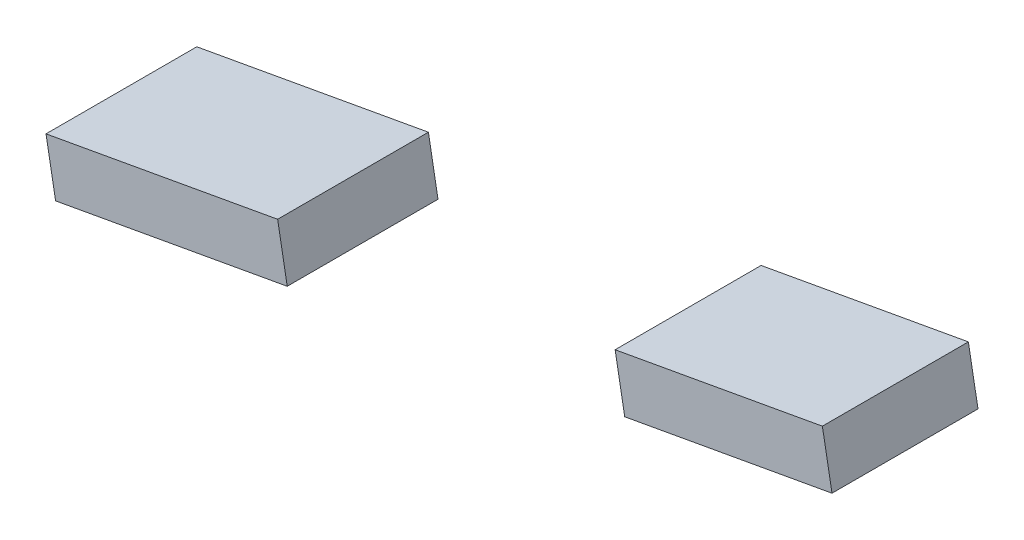
ISO-10303-21;
HEADER;
FILE_DESCRIPTION(('STEP AP214'),'2;1');
FILE_NAME('part.step','',(''),(''),'','','');
FILE_SCHEMA(('AUTOMOTIVE_DESIGN { 1 0 10303 214 1 1 1 1 }'));
ENDSEC;
DATA;
#1=APPLICATION_CONTEXT('core data for automotive mechanical design processes');
#2=APPLICATION_PROTOCOL_DEFINITION('international standard','automotive_design',2000,#1);
#3=PRODUCT_CONTEXT('',#1,'mechanical');
#4=PRODUCT('Part','Part','',(#3));
#5=PRODUCT_RELATED_PRODUCT_CATEGORY('part','',(#4));
#6=PRODUCT_DEFINITION_FORMATION('','',#4);
#7=PRODUCT_DEFINITION_CONTEXT('part definition',#1,'design');
#8=PRODUCT_DEFINITION('design','',#6,#7);
#9=PRODUCT_DEFINITION_SHAPE('','',#8);
#10=(LENGTH_UNIT() NAMED_UNIT(*) SI_UNIT(.MILLI.,.METRE.));
#11=(NAMED_UNIT(*) PLANE_ANGLE_UNIT() SI_UNIT($,.RADIAN.));
#12=(NAMED_UNIT(*) SI_UNIT($,.STERADIAN.) SOLID_ANGLE_UNIT());
#13=UNCERTAINTY_MEASURE_WITH_UNIT(LENGTH_MEASURE(1.E-05),#10,'distance_accuracy_value','');
#14=(GEOMETRIC_REPRESENTATION_CONTEXT(3) GLOBAL_UNCERTAINTY_ASSIGNED_CONTEXT((#13)) GLOBAL_UNIT_ASSIGNED_CONTEXT((#10,
#11,#12)) REPRESENTATION_CONTEXT('',''));
#15=CARTESIAN_POINT('',(0.,0.,0.));
#16=DIRECTION('',(0.,0.,1.));
#17=DIRECTION('',(1.,0.,0.));
#18=AXIS2_PLACEMENT_3D('',#15,#16,#17);
#19=CARTESIAN_POINT('',(50.0562746591321,-48.8797285964406,56.0263041767342));
#20=DIRECTION('',(0.,0.,1.));
#21=DIRECTION('',(0.,-1.,0.));
#22=AXIS2_PLACEMENT_3D('',#19,#20,#21);
#23=PLANE('',#22);
#24=DIRECTION('',(0.984070658910422,0.177777777777788,0.));
#25=VECTOR('',#24,1.);
#26=CARTESIAN_POINT('',(47.9229413257986,-37.0708806895155,56.0263041767342));
#27=LINE('',#26,#25);
#28=CARTESIAN_POINT('',(47.9229413257986,-37.0708806895155,56.0263041767342));
#29=VERTEX_POINT('',#28);
#30=CARTESIAN_POINT('',(93.87467961374,-28.7694463932204,56.0263041767342));
#31=VERTEX_POINT('',#30);
#32=EDGE_CURVE('E12',#29,#31,#27,.T.);
#33=ORIENTED_EDGE('',*,*,#32,.T.);
#34=DIRECTION('',(-0.177777777777787,0.984070658910422,0.));
#35=VECTOR('',#34,1.);
#36=CARTESIAN_POINT('',(96.0080129470735,-40.5782943001454,56.0263041767342));
#37=LINE('',#36,#35);
#38=CARTESIAN_POINT('',(96.0080129470735,-40.5782943001454,56.0263041767342));
#39=VERTEX_POINT('',#38);
#40=EDGE_CURVE('E72',#39,#31,#37,.T.);
#41=ORIENTED_EDGE('',*,*,#40,.F.);
#42=DIRECTION('',(0.984070658910422,0.177777777777788,0.));
#43=VECTOR('',#42,1.);
#44=CARTESIAN_POINT('',(50.0562746591321,-48.8797285964406,56.0263041767342));
#45=LINE('',#44,#43);
#46=CARTESIAN_POINT('',(50.0562746591321,-48.8797285964406,56.0263041767342));
#47=VERTEX_POINT('',#46);
#48=EDGE_CURVE('E57',#47,#39,#45,.T.);
#49=ORIENTED_EDGE('',*,*,#48,.F.);
#50=DIRECTION('',(-0.177777777777787,0.984070658910422,0.));
#51=VECTOR('',#50,1.);
#52=CARTESIAN_POINT('',(50.0562746591321,-48.8797285964406,56.0263041767342));
#53=LINE('',#52,#51);
#54=EDGE_CURVE('E107',#47,#29,#53,.T.);
#55=ORIENTED_EDGE('',*,*,#54,.T.);
#56=EDGE_LOOP('',(#33,#41,#49,#55));
#57=FACE_BOUND('',#56,.T.);
#58=ADVANCED_FACE('F53',(#57),#23,.F.);
#59=CARTESIAN_POINT('',(96.0080129470735,-40.5782943001454,88.394822846241));
#60=DIRECTION('',(0.984070658910422,0.177777777777787,0.));
#61=DIRECTION('',(-0.177777777777788,0.984070658910422,0.));
#62=AXIS2_PLACEMENT_3D('',#59,#60,#61);
#63=PLANE('',#62);
#64=DIRECTION('',(0.,0.,-1.));
#65=VECTOR('',#64,1.);
#66=CARTESIAN_POINT('',(93.87467961374,-28.7694463932204,88.394822846241));
#67=LINE('',#66,#65);
#68=CARTESIAN_POINT('',(93.87467961374,-28.7694463932204,88.394822846241));
#69=VERTEX_POINT('',#68);
#70=EDGE_CURVE('E63',#69,#31,#67,.T.);
#71=ORIENTED_EDGE('',*,*,#70,.F.);
#72=DIRECTION('',(-0.177777777777787,0.984070658910422,0.));
#73=VECTOR('',#72,1.);
#74=CARTESIAN_POINT('',(96.0080129470735,-40.5782943001454,88.394822846241));
#75=LINE('',#74,#73);
#76=CARTESIAN_POINT('',(96.0080129470735,-40.5782943001454,88.394822846241));
#77=VERTEX_POINT('',#76);
#78=EDGE_CURVE('E85',#77,#69,#75,.T.);
#79=ORIENTED_EDGE('',*,*,#78,.F.);
#80=DIRECTION('',(0.,0.,-1.));
#81=VECTOR('',#80,1.);
#82=CARTESIAN_POINT('',(96.0080129470735,-40.5782943001454,88.394822846241));
#83=LINE('',#82,#81);
#84=EDGE_CURVE('E123',#77,#39,#83,.T.);
#85=ORIENTED_EDGE('',*,*,#84,.T.);
#86=ORIENTED_EDGE('',*,*,#40,.T.);
#87=EDGE_LOOP('',(#71,#79,#85,#86));
#88=FACE_BOUND('',#87,.T.);
#89=ADVANCED_FACE('F124',(#88),#63,.T.);
#90=CARTESIAN_POINT('',(50.0562746591321,-48.8797285964406,88.394822846241));
#91=DIRECTION('',(0.,0.,1.));
#92=DIRECTION('',(0.,-1.,0.));
#93=AXIS2_PLACEMENT_3D('',#90,#91,#92);
#94=PLANE('',#93);
#95=DIRECTION('',(0.984070658910422,0.177777777777788,0.));
#96=VECTOR('',#95,1.);
#97=CARTESIAN_POINT('',(47.9229413257986,-37.0708806895155,88.394822846241));
#98=LINE('',#97,#96);
#99=CARTESIAN_POINT('',(47.9229413257986,-37.0708806895155,88.394822846241));
#100=VERTEX_POINT('',#99);
#101=EDGE_CURVE('E114',#100,#69,#98,.T.);
#102=ORIENTED_EDGE('',*,*,#101,.F.);
#103=DIRECTION('',(-0.177777777777787,0.984070658910422,0.));
#104=VECTOR('',#103,1.);
#105=CARTESIAN_POINT('',(50.0562746591321,-48.8797285964406,88.394822846241));
#106=LINE('',#105,#104);
#107=CARTESIAN_POINT('',(50.0562746591321,-48.8797285964406,88.394822846241));
#108=VERTEX_POINT('',#107);
#109=EDGE_CURVE('E100',#108,#100,#106,.T.);
#110=ORIENTED_EDGE('',*,*,#109,.F.);
#111=DIRECTION('',(0.984070658910422,0.177777777777788,0.));
#112=VECTOR('',#111,1.);
#113=CARTESIAN_POINT('',(50.0562746591321,-48.8797285964406,88.394822846241));
#114=LINE('',#113,#112);
#115=EDGE_CURVE('E122',#108,#77,#114,.T.);
#116=ORIENTED_EDGE('',*,*,#115,.T.);
#117=ORIENTED_EDGE('',*,*,#78,.T.);
#118=EDGE_LOOP('',(#102,#110,#116,#117));
#119=FACE_BOUND('',#118,.T.);
#120=ADVANCED_FACE('F116',(#119),#94,.T.);
#121=CARTESIAN_POINT('',(50.0562746591321,-48.8797285964406,88.394822846241));
#122=DIRECTION('',(0.984070658910422,0.177777777777787,0.));
#123=DIRECTION('',(-0.177777777777788,0.984070658910422,0.));
#124=AXIS2_PLACEMENT_3D('',#121,#122,#123);
#125=PLANE('',#124);
#126=DIRECTION('',(0.,0.,-1.));
#127=VECTOR('',#126,1.);
#128=CARTESIAN_POINT('',(47.9229413257986,-37.0708806895155,88.394822846241));
#129=LINE('',#128,#127);
#130=EDGE_CURVE('E97',#100,#29,#129,.T.);
#131=ORIENTED_EDGE('',*,*,#130,.T.);
#132=ORIENTED_EDGE('',*,*,#54,.F.);
#133=DIRECTION('',(0.,0.,-1.));
#134=VECTOR('',#133,1.);
#135=CARTESIAN_POINT('',(50.0562746591321,-48.8797285964406,88.394822846241));
#136=LINE('',#135,#134);
#137=EDGE_CURVE('E102',#108,#47,#136,.T.);
#138=ORIENTED_EDGE('',*,*,#137,.F.);
#139=ORIENTED_EDGE('',*,*,#109,.T.);
#140=EDGE_LOOP('',(#131,#132,#138,#139));
#141=FACE_BOUND('',#140,.T.);
#142=ADVANCED_FACE('F101',(#141),#125,.F.);
#143=CARTESIAN_POINT('',(10.1333333333333,-56.092027557891,0.));
#144=DIRECTION('',(-0.177777777777788,0.984070658910422,0.));
#145=DIRECTION('',(-0.984070658910422,-0.177777777777788,0.));
#146=AXIS2_PLACEMENT_3D('',#143,#144,#145);
#147=PLANE('',#146);
#148=ORIENTED_EDGE('',*,*,#48,.T.);
#149=ORIENTED_EDGE('',*,*,#84,.F.);
#150=ORIENTED_EDGE('',*,*,#115,.F.);
#151=ORIENTED_EDGE('',*,*,#137,.T.);
#152=EDGE_LOOP('',(#148,#149,#150,#151));
#153=FACE_BOUND('',#152,.T.);
#154=ADVANCED_FACE('F55',(#153),#147,.F.);
#155=CARTESIAN_POINT('',(7.9999999999999,-44.2831796509659,0.));
#156=DIRECTION('',(-0.177777777777788,0.984070658910422,0.));
#157=DIRECTION('',(-0.984070658910422,-0.177777777777788,0.));
#158=AXIS2_PLACEMENT_3D('',#155,#156,#157);
#159=PLANE('',#158);
#160=ORIENTED_EDGE('',*,*,#32,.F.);
#161=ORIENTED_EDGE('',*,*,#130,.F.);
#162=ORIENTED_EDGE('',*,*,#101,.T.);
#163=ORIENTED_EDGE('',*,*,#70,.T.);
#164=EDGE_LOOP('',(#160,#161,#162,#163));
#165=FACE_BOUND('',#164,.T.);
#166=ADVANCED_FACE('F112',(#165),#159,.T.);
#167=CLOSED_SHELL('',(#58,#89,#120,#142,#154,#166));
#168=MANIFOLD_SOLID_BREP('B2',#167);
#169=CARTESIAN_POINT('',(-77.5294229358115,-71.9287866994142,53.5500240599413));
#170=DIRECTION('',(0.,0.,1.));
#171=DIRECTION('',(0.,-1.,0.));
#172=AXIS2_PLACEMENT_3D('',#169,#170,#171);
#173=PLANE('',#172);
#174=DIRECTION('',(0.984070658910422,0.177777777777788,0.));
#175=VECTOR('',#174,1.);
#176=CARTESIAN_POINT('',(-79.6627562691449,-60.1199387924891,53.5500240599413));
#177=LINE('',#176,#175);
#178=CARTESIAN_POINT('',(-79.6627562691449,-60.1199387924891,53.5500240599413));
#179=VERTEX_POINT('',#178);
#180=CARTESIAN_POINT('',(-28.3151699246718,-50.8437148629182,53.5500240599413));
#181=VERTEX_POINT('',#180);
#182=EDGE_CURVE('E239',#179,#181,#177,.T.);
#183=ORIENTED_EDGE('',*,*,#182,.T.);
#184=DIRECTION('',(-0.177777777777787,0.984070658910422,0.));
#185=VECTOR('',#184,1.);
#186=CARTESIAN_POINT('',(-26.1818365913384,-62.6525627698433,53.5500240599413));
#187=LINE('',#186,#185);
#188=CARTESIAN_POINT('',(-26.1818365913384,-62.6525627698433,53.5500240599413));
#189=VERTEX_POINT('',#188);
#190=EDGE_CURVE('E51',#189,#181,#187,.T.);
#191=ORIENTED_EDGE('',*,*,#190,.F.);
#192=DIRECTION('',(0.984070658910422,0.177777777777788,0.));
#193=VECTOR('',#192,1.);
#194=CARTESIAN_POINT('',(-77.5294229358115,-71.9287866994142,53.5500240599413));
#195=LINE('',#194,#193);
#196=CARTESIAN_POINT('',(-77.5294229358115,-71.9287866994142,53.5500240599413));
#197=VERTEX_POINT('',#196);
#198=EDGE_CURVE('E216',#197,#189,#195,.T.);
#199=ORIENTED_EDGE('',*,*,#198,.F.);
#200=DIRECTION('',(-0.177777777777787,0.984070658910422,0.));
#201=VECTOR('',#200,1.);
#202=CARTESIAN_POINT('',(-77.5294229358115,-71.9287866994142,53.5500240599413));
#203=LINE('',#202,#201);
#204=EDGE_CURVE('E235',#197,#179,#203,.T.);
#205=ORIENTED_EDGE('',*,*,#204,.T.);
#206=EDGE_LOOP('',(#183,#191,#199,#205));
#207=FACE_BOUND('',#206,.T.);
#208=ADVANCED_FACE('F177',(#207),#173,.F.);
#209=CARTESIAN_POINT('',(-26.1818365913384,-62.6525627698433,86.9798056366451));
#210=DIRECTION('',(0.984070658910422,0.177777777777787,0.));
#211=DIRECTION('',(-0.177777777777788,0.984070658910422,0.));
#212=AXIS2_PLACEMENT_3D('',#209,#210,#211);
#213=PLANE('',#212);
#214=DIRECTION('',(0.,0.,-1.));
#215=VECTOR('',#214,1.);
#216=CARTESIAN_POINT('',(-28.3151699246718,-50.8437148629182,86.9798056366451));
#217=LINE('',#216,#215);
#218=CARTESIAN_POINT('',(-28.3151699246718,-50.8437148629182,86.9798056366451));
#219=VERTEX_POINT('',#218);
#220=EDGE_CURVE('E225',#219,#181,#217,.T.);
#221=ORIENTED_EDGE('',*,*,#220,.F.);
#222=DIRECTION('',(-0.177777777777787,0.984070658910422,0.));
#223=VECTOR('',#222,1.);
#224=CARTESIAN_POINT('',(-26.1818365913384,-62.6525627698433,86.9798056366451));
#225=LINE('',#224,#223);
#226=CARTESIAN_POINT('',(-26.1818365913384,-62.6525627698433,86.9798056366451));
#227=VERTEX_POINT('',#226);
#228=EDGE_CURVE('E185',#227,#219,#225,.T.);
#229=ORIENTED_EDGE('',*,*,#228,.F.);
#230=DIRECTION('',(0.,0.,-1.));
#231=VECTOR('',#230,1.);
#232=CARTESIAN_POINT('',(-26.1818365913384,-62.6525627698433,86.9798056366451));
#233=LINE('',#232,#231);
#234=EDGE_CURVE('E223',#227,#189,#233,.T.);
#235=ORIENTED_EDGE('',*,*,#234,.T.);
#236=ORIENTED_EDGE('',*,*,#190,.T.);
#237=EDGE_LOOP('',(#221,#229,#235,#236));
#238=FACE_BOUND('',#237,.T.);
#239=ADVANCED_FACE('F222',(#238),#213,.T.);
#240=CARTESIAN_POINT('',(-77.5294229358115,-71.9287866994142,86.9798056366451));
#241=DIRECTION('',(0.,0.,1.));
#242=DIRECTION('',(0.,-1.,0.));
#243=AXIS2_PLACEMENT_3D('',#240,#241,#242);
#244=PLANE('',#243);
#245=DIRECTION('',(0.984070658910422,0.177777777777788,0.));
#246=VECTOR('',#245,1.);
#247=CARTESIAN_POINT('',(-79.6627562691449,-60.1199387924891,86.9798056366451));
#248=LINE('',#247,#246);
#249=CARTESIAN_POINT('',(-79.6627562691449,-60.1199387924891,86.9798056366451));
#250=VERTEX_POINT('',#249);
#251=EDGE_CURVE('E243',#250,#219,#248,.T.);
#252=ORIENTED_EDGE('',*,*,#251,.F.);
#253=DIRECTION('',(-0.177777777777787,0.984070658910422,0.));
#254=VECTOR('',#253,1.);
#255=CARTESIAN_POINT('',(-77.5294229358115,-71.9287866994142,86.9798056366451));
#256=LINE('',#255,#254);
#257=CARTESIAN_POINT('',(-77.5294229358115,-71.9287866994142,86.9798056366451));
#258=VERTEX_POINT('',#257);
#259=EDGE_CURVE('E208',#258,#250,#256,.T.);
#260=ORIENTED_EDGE('',*,*,#259,.F.);
#261=DIRECTION('',(0.984070658910422,0.177777777777788,0.));
#262=VECTOR('',#261,1.);
#263=CARTESIAN_POINT('',(-77.5294229358115,-71.9287866994142,86.9798056366451));
#264=LINE('',#263,#262);
#265=EDGE_CURVE('E231',#258,#227,#264,.T.);
#266=ORIENTED_EDGE('',*,*,#265,.T.);
#267=ORIENTED_EDGE('',*,*,#228,.T.);
#268=EDGE_LOOP('',(#252,#260,#266,#267));
#269=FACE_BOUND('',#268,.T.);
#270=ADVANCED_FACE('F233',(#269),#244,.T.);
#271=CARTESIAN_POINT('',(-77.5294229358115,-71.9287866994142,86.9798056366451));
#272=DIRECTION('',(0.984070658910422,0.177777777777787,0.));
#273=DIRECTION('',(-0.177777777777788,0.984070658910422,0.));
#274=AXIS2_PLACEMENT_3D('',#271,#272,#273);
#275=PLANE('',#274);
#276=DIRECTION('',(0.,0.,-1.));
#277=VECTOR('',#276,1.);
#278=CARTESIAN_POINT('',(-79.6627562691449,-60.1199387924891,86.9798056366451));
#279=LINE('',#278,#277);
#280=EDGE_CURVE('E211',#250,#179,#279,.T.);
#281=ORIENTED_EDGE('',*,*,#280,.T.);
#282=ORIENTED_EDGE('',*,*,#204,.F.);
#283=DIRECTION('',(0.,0.,-1.));
#284=VECTOR('',#283,1.);
#285=CARTESIAN_POINT('',(-77.5294229358115,-71.9287866994142,86.9798056366451));
#286=LINE('',#285,#284);
#287=EDGE_CURVE('E193',#258,#197,#286,.T.);
#288=ORIENTED_EDGE('',*,*,#287,.F.);
#289=ORIENTED_EDGE('',*,*,#259,.T.);
#290=EDGE_LOOP('',(#281,#282,#288,#289));
#291=FACE_BOUND('',#290,.T.);
#292=ADVANCED_FACE('F256',(#291),#275,.F.);
#293=CARTESIAN_POINT('',(10.1333333333333,-56.092027557891,0.));
#294=DIRECTION('',(-0.177777777777788,0.984070658910422,0.));
#295=DIRECTION('',(-0.984070658910422,-0.177777777777788,0.));
#296=AXIS2_PLACEMENT_3D('',#293,#294,#295);
#297=PLANE('',#296);
#298=ORIENTED_EDGE('',*,*,#198,.T.);
#299=ORIENTED_EDGE('',*,*,#234,.F.);
#300=ORIENTED_EDGE('',*,*,#265,.F.);
#301=ORIENTED_EDGE('',*,*,#287,.T.);
#302=EDGE_LOOP('',(#298,#299,#300,#301));
#303=FACE_BOUND('',#302,.T.);
#304=ADVANCED_FACE('F230',(#303),#297,.F.);
#305=CARTESIAN_POINT('',(7.99999999999989,-44.2831796509659,0.));
#306=DIRECTION('',(-0.177777777777788,0.984070658910422,0.));
#307=DIRECTION('',(-0.984070658910422,-0.177777777777788,0.));
#308=AXIS2_PLACEMENT_3D('',#305,#306,#307);
#309=PLANE('',#308);
#310=ORIENTED_EDGE('',*,*,#182,.F.);
#311=ORIENTED_EDGE('',*,*,#280,.F.);
#312=ORIENTED_EDGE('',*,*,#251,.T.);
#313=ORIENTED_EDGE('',*,*,#220,.T.);
#314=EDGE_LOOP('',(#310,#311,#312,#313));
#315=FACE_BOUND('',#314,.T.);
#316=ADVANCED_FACE('F250',(#315),#309,.T.);
#317=CLOSED_SHELL('',(#208,#239,#270,#292,#304,#316));
#318=MANIFOLD_SOLID_BREP('B6',#317);
#319=ADVANCED_BREP_SHAPE_REPRESENTATION('',(#18,#168,#318),#14);
#320=SHAPE_DEFINITION_REPRESENTATION(#9,#319);
ENDSEC;
END-ISO-10303-21;
